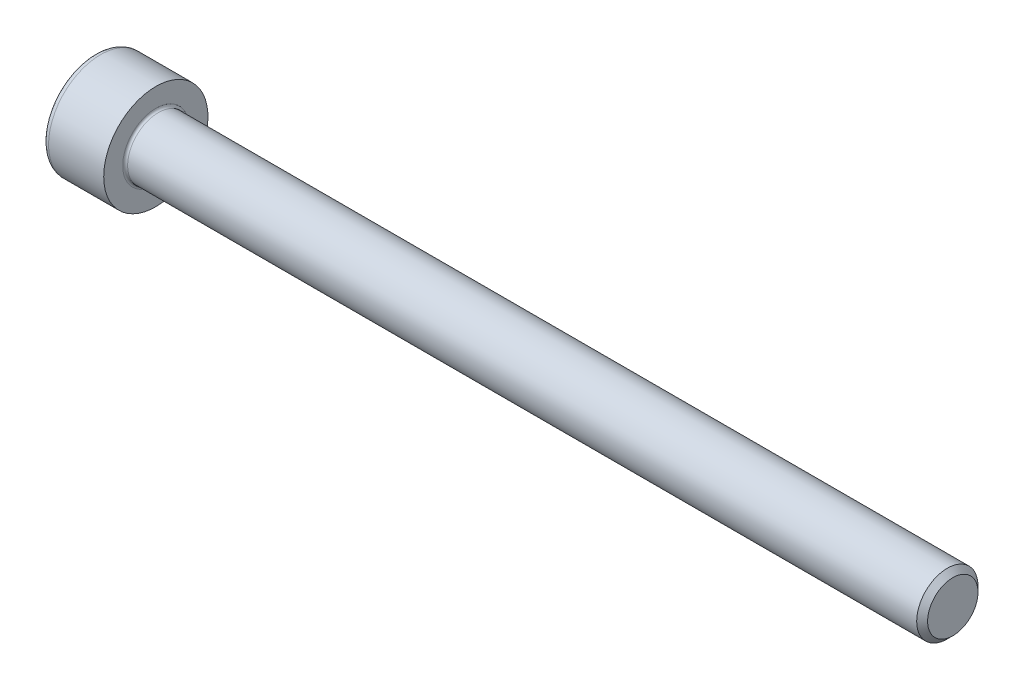
ISO-10303-21;
HEADER;
FILE_DESCRIPTION(('STEP AP214'),'2;1');
FILE_NAME('part.step','',(''),(''),'','','');
FILE_SCHEMA(('AUTOMOTIVE_DESIGN { 1 0 10303 214 1 1 1 1 }'));
ENDSEC;
DATA;
#1=APPLICATION_CONTEXT('core data for automotive mechanical design processes');
#2=APPLICATION_PROTOCOL_DEFINITION('international standard','automotive_design',2000,#1);
#3=PRODUCT_CONTEXT('',#1,'mechanical');
#4=PRODUCT('Part','Part','',(#3));
#5=PRODUCT_RELATED_PRODUCT_CATEGORY('part','',(#4));
#6=PRODUCT_DEFINITION_FORMATION('','',#4);
#7=PRODUCT_DEFINITION_CONTEXT('part definition',#1,'design');
#8=PRODUCT_DEFINITION('design','',#6,#7);
#9=PRODUCT_DEFINITION_SHAPE('','',#8);
#10=(LENGTH_UNIT() NAMED_UNIT(*) SI_UNIT(.MILLI.,.METRE.));
#11=(NAMED_UNIT(*) PLANE_ANGLE_UNIT() SI_UNIT($,.RADIAN.));
#12=(NAMED_UNIT(*) SI_UNIT($,.STERADIAN.) SOLID_ANGLE_UNIT());
#13=UNCERTAINTY_MEASURE_WITH_UNIT(LENGTH_MEASURE(1.E-05),#10,'distance_accuracy_value','');
#14=(GEOMETRIC_REPRESENTATION_CONTEXT(3) GLOBAL_UNCERTAINTY_ASSIGNED_CONTEXT((#13)) GLOBAL_UNIT_ASSIGNED_CONTEXT((#10,
#11,#12)) REPRESENTATION_CONTEXT('',''));
#15=CARTESIAN_POINT('',(0.,0.,0.));
#16=DIRECTION('',(0.,0.,1.));
#17=DIRECTION('',(1.,0.,0.));
#18=AXIS2_PLACEMENT_3D('',#15,#16,#17);
#19=CARTESIAN_POINT('',(0.,0.,0.));
#20=DIRECTION('',(-1.,0.,0.));
#21=DIRECTION('',(0.,0.,1.));
#22=AXIS2_PLACEMENT_3D('',#19,#20,#21);
#23=PLANE('',#22);
#24=DIRECTION('',(0.,-0.499999999999998,0.86602540378444));
#25=VECTOR('',#24,1.);
#26=CARTESIAN_POINT('',(0.,2.32094808214228,0.));
#27=LINE('',#26,#25);
#28=CARTESIAN_POINT('',(0.,2.32094808214228,0.));
#29=VERTEX_POINT('',#28);
#30=CARTESIAN_POINT('',(0.,1.16047404107114,2.01000000000001));
#31=VERTEX_POINT('',#30);
#32=EDGE_CURVE('E269',#29,#31,#27,.T.);
#33=ORIENTED_EDGE('',*,*,#32,.T.);
#34=DIRECTION('',(0.,1.,0.));
#35=VECTOR('',#34,1.);
#36=CARTESIAN_POINT('',(0.,-1.16047404107116,2.01000000000002));
#37=LINE('',#36,#35);
#38=CARTESIAN_POINT('',(0.,-1.16047404107116,2.01000000000002));
#39=VERTEX_POINT('',#38);
#40=EDGE_CURVE('E130',#39,#31,#37,.T.);
#41=ORIENTED_EDGE('',*,*,#40,.F.);
#42=DIRECTION('',(0.,-0.500000000000001,-0.866025403784438));
#43=VECTOR('',#42,1.);
#44=CARTESIAN_POINT('',(0.,-1.16047404107116,2.01000000000002));
#45=LINE('',#44,#43);
#46=CARTESIAN_POINT('',(0.,-2.32094808214231,0.));
#47=VERTEX_POINT('',#46);
#48=EDGE_CURVE('E272',#39,#47,#45,.T.);
#49=ORIENTED_EDGE('',*,*,#48,.T.);
#50=DIRECTION('',(0.,0.499999999999998,-0.86602540378444));
#51=VECTOR('',#50,1.);
#52=CARTESIAN_POINT('',(0.,-2.32094808214231,0.));
#53=LINE('',#52,#51);
#54=CARTESIAN_POINT('',(0.,-1.16047404107116,-2.00999999999998));
#55=VERTEX_POINT('',#54);
#56=EDGE_CURVE('E275',#47,#55,#53,.T.);
#57=ORIENTED_EDGE('',*,*,#56,.T.);
#58=DIRECTION('',(0.,-1.,0.));
#59=VECTOR('',#58,1.);
#60=CARTESIAN_POINT('',(0.,1.16047404107113,-2.00999999999998));
#61=LINE('',#60,#59);
#62=CARTESIAN_POINT('',(0.,1.16047404107113,-2.00999999999998));
#63=VERTEX_POINT('',#62);
#64=EDGE_CURVE('E278',#63,#55,#61,.T.);
#65=ORIENTED_EDGE('',*,*,#64,.F.);
#66=DIRECTION('',(0.,-0.500000000000001,-0.866025403784438));
#67=VECTOR('',#66,1.);
#68=CARTESIAN_POINT('',(0.,2.32094808214228,0.));
#69=LINE('',#68,#67);
#70=EDGE_CURVE('E125',#29,#63,#69,.T.);
#71=ORIENTED_EDGE('',*,*,#70,.F.);
#72=EDGE_LOOP('',(#33,#41,#49,#57,#65,#71));
#73=FACE_BOUND('',#72,.T.);
#74=CARTESIAN_POINT('',(0.,0.,0.));
#75=DIRECTION('',(-1.,0.,0.));
#76=DIRECTION('',(0.,0.,1.));
#77=AXIS2_PLACEMENT_3D('',#74,#75,#76);
#78=CIRCLE('',#77,3.75);
#79=CARTESIAN_POINT('',(0.,0.,3.75));
#80=VERTEX_POINT('',#79);
#81=EDGE_CURVE('E46',#80,#80,#78,.T.);
#82=ORIENTED_EDGE('',*,*,#81,.T.);
#83=EDGE_LOOP('',(#82));
#84=FACE_BOUND('',#83,.T.);
#85=ADVANCED_FACE('F38',(#73,#84),#23,.T.);
#86=CARTESIAN_POINT('',(-31.75,0.,0.));
#87=DIRECTION('',(-1.,0.,0.));
#88=DIRECTION('',(0.,0.,1.));
#89=AXIS2_PLACEMENT_3D('',#86,#87,#88);
#90=CYLINDRICAL_SURFACE('',#89,4.25);
#91=CARTESIAN_POINT('',(0.5,0.,0.));
#92=DIRECTION('',(-1.,0.,0.));
#93=DIRECTION('',(0.,0.,1.));
#94=AXIS2_PLACEMENT_3D('',#91,#92,#93);
#95=CIRCLE('',#94,4.25);
#96=CARTESIAN_POINT('',(0.5,0.,4.25));
#97=VERTEX_POINT('',#96);
#98=EDGE_CURVE('E11',#97,#97,#95,.F.);
#99=ORIENTED_EDGE('',*,*,#98,.T.);
#100=EDGE_LOOP('',(#99));
#101=FACE_BOUND('',#100,.T.);
#102=CARTESIAN_POINT('',(5.,0.,0.));
#103=DIRECTION('',(-1.,0.,0.));
#104=DIRECTION('',(0.,0.,1.));
#105=AXIS2_PLACEMENT_3D('',#102,#103,#104);
#106=CIRCLE('',#105,4.25);
#107=CARTESIAN_POINT('',(5.,0.,4.25));
#108=VERTEX_POINT('',#107);
#109=EDGE_CURVE('E148',#108,#108,#106,.T.);
#110=ORIENTED_EDGE('',*,*,#109,.T.);
#111=EDGE_LOOP('',(#110));
#112=FACE_BOUND('',#111,.T.);
#113=ADVANCED_FACE('F172',(#101,#112),#90,.T.);
#114=CARTESIAN_POINT('',(5.,4.25,0.));
#115=DIRECTION('',(1.,0.,0.));
#116=DIRECTION('',(0.,0.,-1.));
#117=AXIS2_PLACEMENT_3D('',#114,#115,#116);
#118=PLANE('',#117);
#119=CARTESIAN_POINT('',(5.,0.,0.));
#120=DIRECTION('',(1.,0.,0.));
#121=DIRECTION('',(0.,0.,-1.));
#122=AXIS2_PLACEMENT_3D('',#119,#120,#121);
#123=CIRCLE('',#122,2.69999999999998);
#124=CARTESIAN_POINT('',(5.,0.,-2.69999999999998));
#125=VERTEX_POINT('',#124);
#126=EDGE_CURVE('E151',#125,#125,#123,.F.);
#127=ORIENTED_EDGE('',*,*,#126,.T.);
#128=EDGE_LOOP('',(#127));
#129=FACE_BOUND('',#128,.T.);
#130=ORIENTED_EDGE('',*,*,#109,.F.);
#131=EDGE_LOOP('',(#130));
#132=FACE_BOUND('',#131,.T.);
#133=ADVANCED_FACE('F178',(#129,#132),#118,.T.);
#134=CARTESIAN_POINT('',(-31.75,0.,0.));
#135=DIRECTION('',(-1.,0.,0.));
#136=DIRECTION('',(0.,0.,1.));
#137=AXIS2_PLACEMENT_3D('',#134,#135,#136);
#138=CYLINDRICAL_SURFACE('',#137,2.49999999999998);
#139=CARTESIAN_POINT('',(5.2,0.,0.));
#140=DIRECTION('',(1.,0.,0.));
#141=DIRECTION('',(0.,0.,-1.));
#142=AXIS2_PLACEMENT_3D('',#139,#140,#141);
#143=CIRCLE('',#142,2.49999999999998);
#144=CARTESIAN_POINT('',(5.2,0.,-2.49999999999998));
#145=VERTEX_POINT('',#144);
#146=EDGE_CURVE('E154',#145,#145,#143,.T.);
#147=ORIENTED_EDGE('',*,*,#146,.T.);
#148=EDGE_LOOP('',(#147));
#149=FACE_BOUND('',#148,.T.);
#150=CARTESIAN_POINT('',(69.555,0.,0.));
#151=DIRECTION('',(-1.,0.,0.));
#152=DIRECTION('',(0.,0.,1.));
#153=AXIS2_PLACEMENT_3D('',#150,#151,#152);
#154=CIRCLE('',#153,2.49999999999996);
#155=CARTESIAN_POINT('',(69.555,0.,2.49999999999996));
#156=VERTEX_POINT('',#155);
#157=EDGE_CURVE('E145',#156,#156,#154,.T.);
#158=ORIENTED_EDGE('',*,*,#157,.T.);
#159=EDGE_LOOP('',(#158));
#160=FACE_BOUND('',#159,.T.);
#161=ADVANCED_FACE('F184',(#149,#160),#138,.T.);
#162=CARTESIAN_POINT('',(70.,0.,0.));
#163=DIRECTION('',(-1.,0.,0.));
#164=DIRECTION('',(0.,0.,1.));
#165=AXIS2_PLACEMENT_3D('',#162,#163,#164);
#166=CONICAL_SURFACE('',#165,2.055,0.785398163397353);
#167=ORIENTED_EDGE('',*,*,#157,.F.);
#168=EDGE_LOOP('',(#167));
#169=FACE_BOUND('',#168,.T.);
#170=CARTESIAN_POINT('',(70.,0.,0.));
#171=DIRECTION('',(-1.,0.,0.));
#172=DIRECTION('',(0.,0.,1.));
#173=AXIS2_PLACEMENT_3D('',#170,#171,#172);
#174=CIRCLE('',#173,2.055);
#175=CARTESIAN_POINT('',(70.,0.,2.055));
#176=VERTEX_POINT('',#175);
#177=EDGE_CURVE('E141',#176,#176,#174,.T.);
#178=ORIENTED_EDGE('',*,*,#177,.T.);
#179=EDGE_LOOP('',(#178));
#180=FACE_BOUND('',#179,.T.);
#181=ADVANCED_FACE('F188',(#169,#180),#166,.T.);
#182=CARTESIAN_POINT('',(70.,2.055,0.));
#183=DIRECTION('',(1.,0.,0.));
#184=DIRECTION('',(0.,0.,-1.));
#185=AXIS2_PLACEMENT_3D('',#182,#183,#184);
#186=PLANE('',#185);
#187=ORIENTED_EDGE('',*,*,#177,.F.);
#188=EDGE_LOOP('',(#187));
#189=FACE_BOUND('',#188,.T.);
#190=ADVANCED_FACE('F168',(#189),#186,.T.);
#191=CARTESIAN_POINT('',(5.2,0.,0.));
#192=DIRECTION('',(1.,0.,0.));
#193=DIRECTION('',(0.,0.,-1.));
#194=AXIS2_PLACEMENT_3D('',#191,#192,#193);
#195=TOROIDAL_SURFACE('',#194,2.69999999999998,0.2);
#196=ORIENTED_EDGE('',*,*,#146,.F.);
#197=EDGE_LOOP('',(#196));
#198=FACE_BOUND('',#197,.T.);
#199=ORIENTED_EDGE('',*,*,#126,.F.);
#200=EDGE_LOOP('',(#199));
#201=FACE_BOUND('',#200,.T.);
#202=ADVANCED_FACE('F161',(#198,#201),#195,.F.);
#203=CARTESIAN_POINT('',(0.5,0.,0.));
#204=DIRECTION('',(-1.,0.,0.));
#205=DIRECTION('',(0.,0.,1.));
#206=AXIS2_PLACEMENT_3D('',#203,#204,#205);
#207=TOROIDAL_SURFACE('',#206,3.75,0.5);
#208=ORIENTED_EDGE('',*,*,#98,.F.);
#209=EDGE_LOOP('',(#208));
#210=FACE_BOUND('',#209,.T.);
#211=ORIENTED_EDGE('',*,*,#81,.F.);
#212=EDGE_LOOP('',(#211));
#213=FACE_BOUND('',#212,.T.);
#214=ADVANCED_FACE('F40',(#210,#213),#207,.T.);
#215=CARTESIAN_POINT('',(2.5,2.32094808214228,0.));
#216=DIRECTION('',(0.,-0.86602540378444,-0.499999999999998));
#217=DIRECTION('',(0.,0.499999999999998,-0.86602540378444));
#218=AXIS2_PLACEMENT_3D('',#215,#216,#217);
#219=PLANE('',#218);
#220=ORIENTED_EDGE('',*,*,#32,.F.);
#221=DIRECTION('',(-1.,0.,0.));
#222=VECTOR('',#221,1.);
#223=CARTESIAN_POINT('',(2.5,2.32094808214228,0.));
#224=LINE('',#223,#222);
#225=CARTESIAN_POINT('',(2.5,2.32094808214228,0.));
#226=VERTEX_POINT('',#225);
#227=EDGE_CURVE('E268',#226,#29,#224,.T.);
#228=ORIENTED_EDGE('',*,*,#227,.F.);
#229=DIRECTION('',(0.,-0.499999999999998,0.86602540378444));
#230=VECTOR('',#229,1.);
#231=CARTESIAN_POINT('',(2.5,2.32094808214228,0.));
#232=LINE('',#231,#230);
#233=CARTESIAN_POINT('',(2.5,1.74071106160672,1.005));
#234=VERTEX_POINT('',#233);
#235=EDGE_CURVE('E53',#226,#234,#232,.T.);
#236=ORIENTED_EDGE('',*,*,#235,.T.);
#237=CARTESIAN_POINT('',(2.5,1.16047404107114,2.01000000000001));
#238=VERTEX_POINT('',#237);
#239=EDGE_CURVE('E111',#234,#238,#232,.T.);
#240=ORIENTED_EDGE('',*,*,#239,.T.);
#241=DIRECTION('',(-1.,0.,0.));
#242=VECTOR('',#241,1.);
#243=CARTESIAN_POINT('',(2.5,1.16047404107114,2.01000000000001));
#244=LINE('',#243,#242);
#245=EDGE_CURVE('E123',#238,#31,#244,.T.);
#246=ORIENTED_EDGE('',*,*,#245,.T.);
#247=EDGE_LOOP('',(#220,#228,#236,#240,#246));
#248=FACE_BOUND('',#247,.T.);
#249=ADVANCED_FACE('F122',(#248),#219,.T.);
#250=CARTESIAN_POINT('',(2.5,-1.16047404107116,2.01000000000002));
#251=DIRECTION('',(0.,0.,1.));
#252=DIRECTION('',(0.,-1.,0.));
#253=AXIS2_PLACEMENT_3D('',#250,#251,#252);
#254=PLANE('',#253);
#255=ORIENTED_EDGE('',*,*,#40,.T.);
#256=ORIENTED_EDGE('',*,*,#245,.F.);
#257=DIRECTION('',(0.,1.,0.));
#258=VECTOR('',#257,1.);
#259=CARTESIAN_POINT('',(2.5,-1.16047404107116,2.01000000000002));
#260=LINE('',#259,#258);
#261=CARTESIAN_POINT('',(2.5,0.,2.01000000000002));
#262=VERTEX_POINT('',#261);
#263=EDGE_CURVE('E109',#262,#238,#260,.T.);
#264=ORIENTED_EDGE('',*,*,#263,.F.);
#265=CARTESIAN_POINT('',(2.5,-1.16047404107116,2.01000000000002));
#266=VERTEX_POINT('',#265);
#267=EDGE_CURVE('E119',#266,#262,#260,.T.);
#268=ORIENTED_EDGE('',*,*,#267,.F.);
#269=DIRECTION('',(-1.,0.,0.));
#270=VECTOR('',#269,1.);
#271=CARTESIAN_POINT('',(2.5,-1.16047404107116,2.01000000000002));
#272=LINE('',#271,#270);
#273=EDGE_CURVE('E132',#266,#39,#272,.T.);
#274=ORIENTED_EDGE('',*,*,#273,.T.);
#275=EDGE_LOOP('',(#255,#256,#264,#268,#274));
#276=FACE_BOUND('',#275,.T.);
#277=ADVANCED_FACE('F127',(#276),#254,.F.);
#278=CARTESIAN_POINT('',(2.5,-1.16047404107116,2.01000000000002));
#279=DIRECTION('',(0.,0.866025403784438,-0.500000000000001));
#280=DIRECTION('',(0.,0.500000000000001,0.866025403784438));
#281=AXIS2_PLACEMENT_3D('',#278,#279,#280);
#282=PLANE('',#281);
#283=ORIENTED_EDGE('',*,*,#48,.F.);
#284=ORIENTED_EDGE('',*,*,#273,.F.);
#285=DIRECTION('',(0.,-0.500000000000001,-0.866025403784438));
#286=VECTOR('',#285,1.);
#287=CARTESIAN_POINT('',(2.5,-1.16047404107116,2.01000000000002));
#288=LINE('',#287,#286);
#289=CARTESIAN_POINT('',(2.5,-1.74071106160674,1.00500000000001));
#290=VERTEX_POINT('',#289);
#291=EDGE_CURVE('E249',#266,#290,#288,.T.);
#292=ORIENTED_EDGE('',*,*,#291,.T.);
#293=CARTESIAN_POINT('',(2.5,-2.32094808214231,0.));
#294=VERTEX_POINT('',#293);
#295=EDGE_CURVE('E251',#290,#294,#288,.T.);
#296=ORIENTED_EDGE('',*,*,#295,.T.);
#297=DIRECTION('',(-1.,0.,0.));
#298=VECTOR('',#297,1.);
#299=CARTESIAN_POINT('',(2.5,-2.32094808214231,0.));
#300=LINE('',#299,#298);
#301=EDGE_CURVE('E137',#294,#47,#300,.T.);
#302=ORIENTED_EDGE('',*,*,#301,.T.);
#303=EDGE_LOOP('',(#283,#284,#292,#296,#302));
#304=FACE_BOUND('',#303,.T.);
#305=ADVANCED_FACE('F201',(#304),#282,.T.);
#306=CARTESIAN_POINT('',(2.5,-2.32094808214231,0.));
#307=DIRECTION('',(0.,0.86602540378444,0.499999999999998));
#308=DIRECTION('',(0.,-0.499999999999998,0.86602540378444));
#309=AXIS2_PLACEMENT_3D('',#306,#307,#308);
#310=PLANE('',#309);
#311=ORIENTED_EDGE('',*,*,#56,.F.);
#312=ORIENTED_EDGE('',*,*,#301,.F.);
#313=DIRECTION('',(0.,0.499999999999998,-0.86602540378444));
#314=VECTOR('',#313,1.);
#315=CARTESIAN_POINT('',(2.5,-2.32094808214231,0.));
#316=LINE('',#315,#314);
#317=CARTESIAN_POINT('',(2.5,-1.74071106160673,-1.005));
#318=VERTEX_POINT('',#317);
#319=EDGE_CURVE('E254',#294,#318,#316,.T.);
#320=ORIENTED_EDGE('',*,*,#319,.T.);
#321=CARTESIAN_POINT('',(2.5,-1.16047404107116,-2.00999999999998));
#322=VERTEX_POINT('',#321);
#323=EDGE_CURVE('E258',#318,#322,#316,.T.);
#324=ORIENTED_EDGE('',*,*,#323,.T.);
#325=DIRECTION('',(-1.,0.,0.));
#326=VECTOR('',#325,1.);
#327=CARTESIAN_POINT('',(2.5,-1.16047404107116,-2.00999999999998));
#328=LINE('',#327,#326);
#329=EDGE_CURVE('E287',#322,#55,#328,.T.);
#330=ORIENTED_EDGE('',*,*,#329,.T.);
#331=EDGE_LOOP('',(#311,#312,#320,#324,#330));
#332=FACE_BOUND('',#331,.T.);
#333=ADVANCED_FACE('F204',(#332),#310,.T.);
#334=CARTESIAN_POINT('',(2.5,1.16047404107113,-2.00999999999998));
#335=DIRECTION('',(0.,0.,-1.));
#336=DIRECTION('',(0.,1.,0.));
#337=AXIS2_PLACEMENT_3D('',#334,#335,#336);
#338=PLANE('',#337);
#339=ORIENTED_EDGE('',*,*,#64,.T.);
#340=ORIENTED_EDGE('',*,*,#329,.F.);
#341=DIRECTION('',(0.,-1.,0.));
#342=VECTOR('',#341,1.);
#343=CARTESIAN_POINT('',(2.5,1.16047404107113,-2.00999999999998));
#344=LINE('',#343,#342);
#345=CARTESIAN_POINT('',(2.5,0.,-2.00999999999998));
#346=VERTEX_POINT('',#345);
#347=EDGE_CURVE('E262',#346,#322,#344,.T.);
#348=ORIENTED_EDGE('',*,*,#347,.F.);
#349=CARTESIAN_POINT('',(2.5,1.16047404107113,-2.00999999999998));
#350=VERTEX_POINT('',#349);
#351=EDGE_CURVE('E263',#350,#346,#344,.T.);
#352=ORIENTED_EDGE('',*,*,#351,.F.);
#353=DIRECTION('',(-1.,0.,0.));
#354=VECTOR('',#353,1.);
#355=CARTESIAN_POINT('',(2.5,1.16047404107113,-2.00999999999998));
#356=LINE('',#355,#354);
#357=EDGE_CURVE('E284',#350,#63,#356,.T.);
#358=ORIENTED_EDGE('',*,*,#357,.T.);
#359=EDGE_LOOP('',(#339,#340,#348,#352,#358));
#360=FACE_BOUND('',#359,.T.);
#361=ADVANCED_FACE('F208',(#360),#338,.F.);
#362=CARTESIAN_POINT('',(2.5,2.32094808214228,0.));
#363=DIRECTION('',(0.,0.866025403784438,-0.500000000000001));
#364=DIRECTION('',(0.,0.500000000000001,0.866025403784438));
#365=AXIS2_PLACEMENT_3D('',#362,#363,#364);
#366=PLANE('',#365);
#367=ORIENTED_EDGE('',*,*,#70,.T.);
#368=ORIENTED_EDGE('',*,*,#357,.F.);
#369=DIRECTION('',(0.,-0.500000000000001,-0.866025403784438));
#370=VECTOR('',#369,1.);
#371=CARTESIAN_POINT('',(2.5,2.32094808214228,0.));
#372=LINE('',#371,#370);
#373=CARTESIAN_POINT('',(2.5,1.7407110616067,-1.00499999999999));
#374=VERTEX_POINT('',#373);
#375=EDGE_CURVE('E266',#374,#350,#372,.T.);
#376=ORIENTED_EDGE('',*,*,#375,.F.);
#377=EDGE_CURVE('E240',#226,#374,#372,.T.);
#378=ORIENTED_EDGE('',*,*,#377,.F.);
#379=ORIENTED_EDGE('',*,*,#227,.T.);
#380=EDGE_LOOP('',(#367,#368,#376,#378,#379));
#381=FACE_BOUND('',#380,.T.);
#382=ADVANCED_FACE('F212',(#381),#366,.F.);
#383=CARTESIAN_POINT('',(2.5,1.16047404107114,2.01000000000001));
#384=DIRECTION('',(-1.,0.,0.));
#385=DIRECTION('',(0.,0.,1.));
#386=AXIS2_PLACEMENT_3D('',#383,#384,#385);
#387=PLANE('',#386);
#388=CARTESIAN_POINT('',(2.5,0.,0.));
#389=DIRECTION('',(-1.,0.,0.));
#390=DIRECTION('',(0.,0.,1.));
#391=AXIS2_PLACEMENT_3D('',#388,#389,#390);
#392=CIRCLE('',#391,2.01);
#393=EDGE_CURVE('E131',#290,#262,#392,.T.);
#394=ORIENTED_EDGE('',*,*,#393,.F.);
#395=ORIENTED_EDGE('',*,*,#291,.F.);
#396=ORIENTED_EDGE('',*,*,#267,.T.);
#397=EDGE_LOOP('',(#394,#395,#396));
#398=FACE_BOUND('',#397,.T.);
#399=ADVANCED_FACE('F216',(#398),#387,.T.);
#400=EDGE_CURVE('E135',#318,#290,#392,.T.);
#401=ORIENTED_EDGE('',*,*,#400,.F.);
#402=ORIENTED_EDGE('',*,*,#319,.F.);
#403=ORIENTED_EDGE('',*,*,#295,.F.);
#404=EDGE_LOOP('',(#401,#402,#403));
#405=FACE_BOUND('',#404,.T.);
#406=ADVANCED_FACE('F219',(#405),#387,.T.);
#407=EDGE_CURVE('E293',#346,#318,#392,.T.);
#408=ORIENTED_EDGE('',*,*,#407,.F.);
#409=ORIENTED_EDGE('',*,*,#347,.T.);
#410=ORIENTED_EDGE('',*,*,#323,.F.);
#411=EDGE_LOOP('',(#408,#409,#410));
#412=FACE_BOUND('',#411,.T.);
#413=ADVANCED_FACE('F224',(#412),#387,.T.);
#414=EDGE_CURVE('E243',#374,#346,#392,.T.);
#415=ORIENTED_EDGE('',*,*,#414,.F.);
#416=ORIENTED_EDGE('',*,*,#375,.T.);
#417=ORIENTED_EDGE('',*,*,#351,.T.);
#418=EDGE_LOOP('',(#415,#416,#417));
#419=FACE_BOUND('',#418,.T.);
#420=ADVANCED_FACE('F231',(#419),#387,.T.);
#421=EDGE_CURVE('E142',#234,#374,#392,.T.);
#422=ORIENTED_EDGE('',*,*,#421,.F.);
#423=ORIENTED_EDGE('',*,*,#235,.F.);
#424=ORIENTED_EDGE('',*,*,#377,.T.);
#425=EDGE_LOOP('',(#422,#423,#424));
#426=FACE_BOUND('',#425,.T.);
#427=ADVANCED_FACE('F227',(#426),#387,.T.);
#428=EDGE_CURVE('E114',#262,#234,#392,.T.);
#429=ORIENTED_EDGE('',*,*,#428,.F.);
#430=ORIENTED_EDGE('',*,*,#263,.T.);
#431=ORIENTED_EDGE('',*,*,#239,.F.);
#432=EDGE_LOOP('',(#429,#430,#431));
#433=FACE_BOUND('',#432,.T.);
#434=ADVANCED_FACE('F110',(#433),#387,.T.);
#435=CARTESIAN_POINT('',(2.5,0.,0.));
#436=DIRECTION('',(-1.,0.,0.));
#437=DIRECTION('',(0.,0.,1.));
#438=AXIS2_PLACEMENT_3D('',#435,#436,#437);
#439=CONICAL_SURFACE('',#438,2.01,1.04719755119659);
#440=CARTESIAN_POINT('',(3.66047404107116,0.,0.));
#441=VERTEX_POINT('',#440);
#442=VERTEX_LOOP('',#441);
#443=FACE_BOUND('',#442,.T.);
#444=ORIENTED_EDGE('',*,*,#428,.T.);
#445=ORIENTED_EDGE('',*,*,#421,.T.);
#446=ORIENTED_EDGE('',*,*,#414,.T.);
#447=ORIENTED_EDGE('',*,*,#407,.T.);
#448=ORIENTED_EDGE('',*,*,#400,.T.);
#449=ORIENTED_EDGE('',*,*,#393,.T.);
#450=EDGE_LOOP('',(#444,#445,#446,#447,#448,#449));
#451=FACE_BOUND('',#450,.T.);
#452=ADVANCED_FACE('F196',(#443,#451),#439,.F.);
#453=CLOSED_SHELL('',(#85,#113,#133,#161,#181,#190,#202,#214,#249,#277,#305,#333,#361,#382,#399,
#406,#413,#420,#427,#434,#452));
#454=MANIFOLD_SOLID_BREP('B2',#453);
#455=ADVANCED_BREP_SHAPE_REPRESENTATION('',(#18,#454),#14);
#456=SHAPE_DEFINITION_REPRESENTATION(#9,#455);
ENDSEC;
END-ISO-10303-21;
